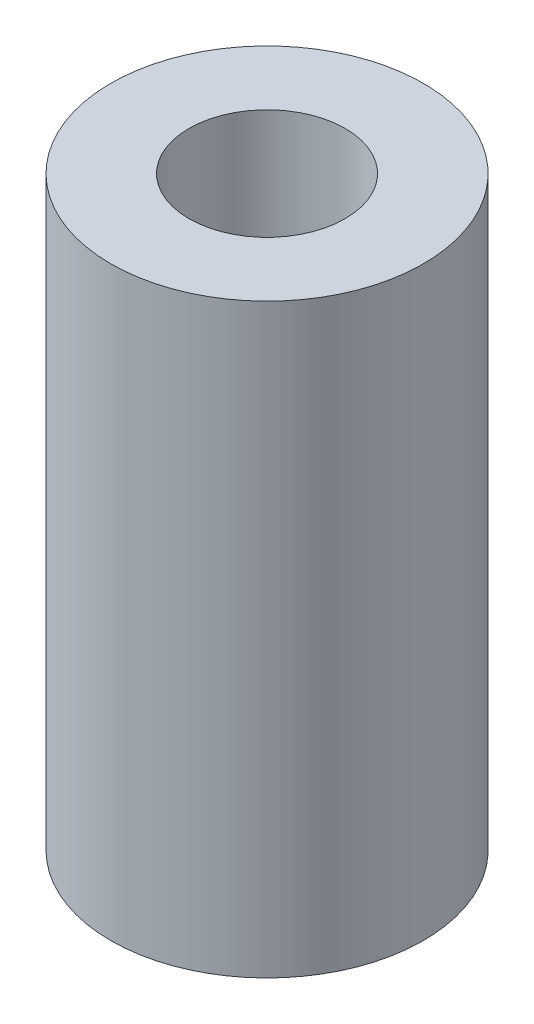
ISO-10303-21;
HEADER;
FILE_DESCRIPTION(('STEP AP214'),'2;1');
FILE_NAME('part.step','',(''),(''),'','','');
FILE_SCHEMA(('AUTOMOTIVE_DESIGN { 1 0 10303 214 1 1 1 1 }'));
ENDSEC;
DATA;
#1=APPLICATION_CONTEXT('core data for automotive mechanical design processes');
#2=APPLICATION_PROTOCOL_DEFINITION('international standard','automotive_design',2000,#1);
#3=PRODUCT_CONTEXT('',#1,'mechanical');
#4=PRODUCT('Part','Part','',(#3));
#5=PRODUCT_RELATED_PRODUCT_CATEGORY('part','',(#4));
#6=PRODUCT_DEFINITION_FORMATION('','',#4);
#7=PRODUCT_DEFINITION_CONTEXT('part definition',#1,'design');
#8=PRODUCT_DEFINITION('design','',#6,#7);
#9=PRODUCT_DEFINITION_SHAPE('','',#8);
#10=(LENGTH_UNIT() NAMED_UNIT(*) SI_UNIT(.MILLI.,.METRE.));
#11=(NAMED_UNIT(*) PLANE_ANGLE_UNIT() SI_UNIT($,.RADIAN.));
#12=(NAMED_UNIT(*) SI_UNIT($,.STERADIAN.) SOLID_ANGLE_UNIT());
#13=UNCERTAINTY_MEASURE_WITH_UNIT(LENGTH_MEASURE(1.E-05),#10,'distance_accuracy_value','');
#14=(GEOMETRIC_REPRESENTATION_CONTEXT(3) GLOBAL_UNCERTAINTY_ASSIGNED_CONTEXT((#13)) GLOBAL_UNIT_ASSIGNED_CONTEXT((#10,
#11,#12)) REPRESENTATION_CONTEXT('',''));
#15=CARTESIAN_POINT('',(0.,0.,0.));
#16=DIRECTION('',(0.,0.,1.));
#17=DIRECTION('',(1.,0.,0.));
#18=AXIS2_PLACEMENT_3D('',#15,#16,#17);
#19=CARTESIAN_POINT('',(0.,30.,0.));
#20=DIRECTION('',(0.,1.,0.));
#21=DIRECTION('',(0.,0.,1.));
#22=AXIS2_PLACEMENT_3D('',#19,#20,#21);
#23=PLANE('',#22);
#24=CARTESIAN_POINT('',(0.,30.,0.));
#25=DIRECTION('',(0.,1.,0.));
#26=DIRECTION('',(0.,0.,1.));
#27=AXIS2_PLACEMENT_3D('',#24,#25,#26);
#28=CIRCLE('',#27,8.);
#29=CARTESIAN_POINT('',(0.,30.,8.));
#30=VERTEX_POINT('',#29);
#31=EDGE_CURVE('E10',#30,#30,#28,.T.);
#32=ORIENTED_EDGE('',*,*,#31,.T.);
#33=EDGE_LOOP('',(#32));
#34=FACE_BOUND('',#33,.T.);
#35=CARTESIAN_POINT('',(0.,30.,0.));
#36=DIRECTION('',(0.,1.,0.));
#37=DIRECTION('',(0.,0.,1.));
#38=AXIS2_PLACEMENT_3D('',#35,#36,#37);
#39=CIRCLE('',#38,4.);
#40=CARTESIAN_POINT('',(0.,30.,4.));
#41=VERTEX_POINT('',#40);
#42=EDGE_CURVE('E53',#41,#41,#39,.T.);
#43=ORIENTED_EDGE('',*,*,#42,.F.);
#44=EDGE_LOOP('',(#43));
#45=FACE_BOUND('',#44,.T.);
#46=ADVANCED_FACE('F40',(#34,#45),#23,.T.);
#47=CARTESIAN_POINT('',(0.,0.,0.));
#48=DIRECTION('',(0.,1.,0.));
#49=DIRECTION('',(0.,0.,1.));
#50=AXIS2_PLACEMENT_3D('',#47,#48,#49);
#51=PLANE('',#50);
#52=CARTESIAN_POINT('',(0.,0.,0.));
#53=DIRECTION('',(0.,1.,0.));
#54=DIRECTION('',(0.,0.,1.));
#55=AXIS2_PLACEMENT_3D('',#52,#53,#54);
#56=CIRCLE('',#55,8.);
#57=CARTESIAN_POINT('',(0.,0.,8.));
#58=VERTEX_POINT('',#57);
#59=EDGE_CURVE('E44',#58,#58,#56,.T.);
#60=ORIENTED_EDGE('',*,*,#59,.F.);
#61=EDGE_LOOP('',(#60));
#62=FACE_BOUND('',#61,.T.);
#63=CARTESIAN_POINT('',(0.,0.,0.));
#64=DIRECTION('',(0.,1.,0.));
#65=DIRECTION('',(0.,0.,1.));
#66=AXIS2_PLACEMENT_3D('',#63,#64,#65);
#67=CIRCLE('',#66,4.);
#68=CARTESIAN_POINT('',(0.,0.,4.));
#69=VERTEX_POINT('',#68);
#70=EDGE_CURVE('E55',#69,#69,#67,.T.);
#71=ORIENTED_EDGE('',*,*,#70,.T.);
#72=EDGE_LOOP('',(#71));
#73=FACE_BOUND('',#72,.T.);
#74=ADVANCED_FACE('F67',(#62,#73),#51,.F.);
#75=CARTESIAN_POINT('',(0.,30.,0.));
#76=DIRECTION('',(0.,-1.,0.));
#77=DIRECTION('',(0.,0.,-1.));
#78=AXIS2_PLACEMENT_3D('',#75,#76,#77);
#79=CYLINDRICAL_SURFACE('',#78,8.);
#80=ORIENTED_EDGE('',*,*,#31,.F.);
#81=EDGE_LOOP('',(#80));
#82=FACE_BOUND('',#81,.T.);
#83=ORIENTED_EDGE('',*,*,#59,.T.);
#84=EDGE_LOOP('',(#83));
#85=FACE_BOUND('',#84,.T.);
#86=ADVANCED_FACE('F42',(#82,#85),#79,.T.);
#87=CARTESIAN_POINT('',(0.,30.,0.));
#88=DIRECTION('',(0.,-1.,0.));
#89=DIRECTION('',(0.,0.,-1.));
#90=AXIS2_PLACEMENT_3D('',#87,#88,#89);
#91=CYLINDRICAL_SURFACE('',#90,4.);
#92=ORIENTED_EDGE('',*,*,#42,.T.);
#93=EDGE_LOOP('',(#92));
#94=FACE_BOUND('',#93,.T.);
#95=ORIENTED_EDGE('',*,*,#70,.F.);
#96=EDGE_LOOP('',(#95));
#97=FACE_BOUND('',#96,.T.);
#98=ADVANCED_FACE('F63',(#94,#97),#91,.F.);
#99=CLOSED_SHELL('',(#46,#74,#86,#98));
#100=MANIFOLD_SOLID_BREP('B2',#99);
#101=ADVANCED_BREP_SHAPE_REPRESENTATION('',(#18,#100),#14);
#102=SHAPE_DEFINITION_REPRESENTATION(#9,#101);
ENDSEC;
END-ISO-10303-21;
